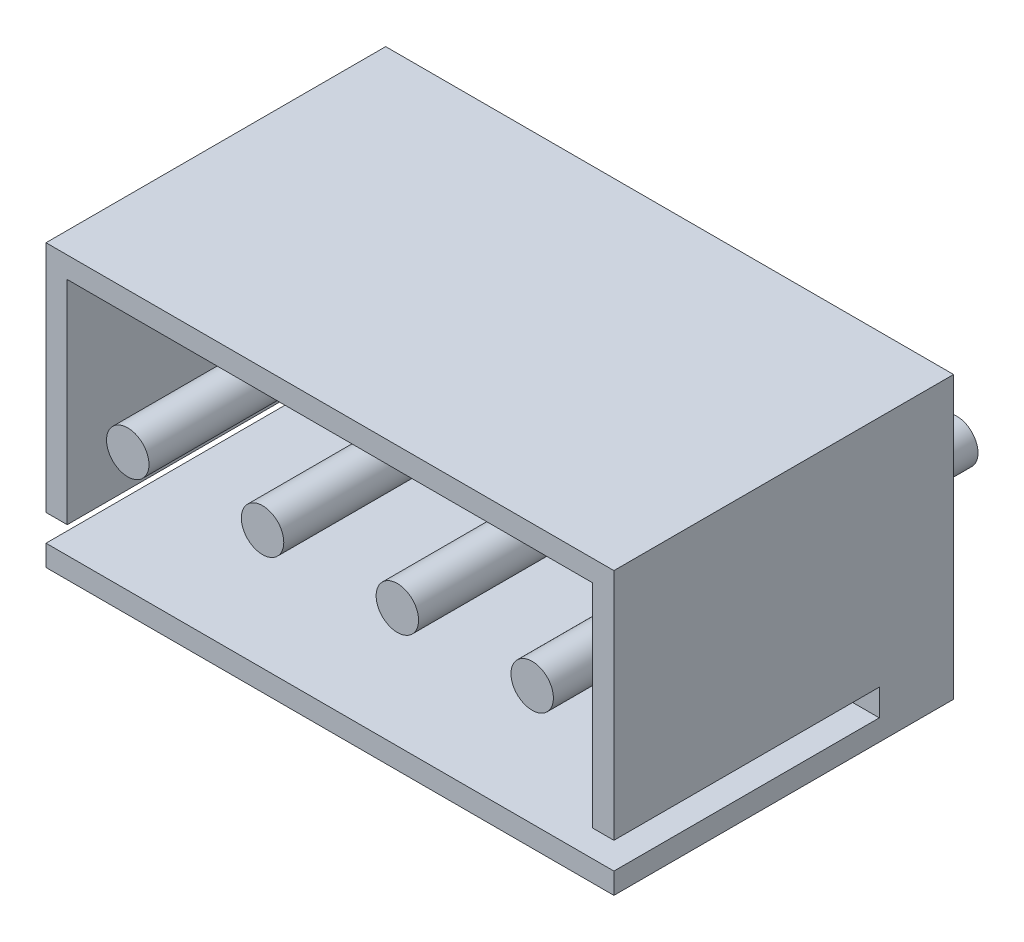
ISO-10303-21;
HEADER;
FILE_DESCRIPTION(('STEP AP214'),'2;1');
FILE_NAME('part.step','',(''),(''),'','','');
FILE_SCHEMA(('AUTOMOTIVE_DESIGN { 1 0 10303 214 1 1 1 1 }'));
ENDSEC;
DATA;
#1=APPLICATION_CONTEXT('core data for automotive mechanical design processes');
#2=APPLICATION_PROTOCOL_DEFINITION('international standard','automotive_design',2000,#1);
#3=PRODUCT_CONTEXT('',#1,'mechanical');
#4=PRODUCT('Part','Part','',(#3));
#5=PRODUCT_RELATED_PRODUCT_CATEGORY('part','',(#4));
#6=PRODUCT_DEFINITION_FORMATION('','',#4);
#7=PRODUCT_DEFINITION_CONTEXT('part definition',#1,'design');
#8=PRODUCT_DEFINITION('design','',#6,#7);
#9=PRODUCT_DEFINITION_SHAPE('','',#8);
#10=(LENGTH_UNIT() NAMED_UNIT(*) SI_UNIT(.MILLI.,.METRE.));
#11=(NAMED_UNIT(*) PLANE_ANGLE_UNIT() SI_UNIT($,.RADIAN.));
#12=(NAMED_UNIT(*) SI_UNIT($,.STERADIAN.) SOLID_ANGLE_UNIT());
#13=UNCERTAINTY_MEASURE_WITH_UNIT(LENGTH_MEASURE(1.E-05),#10,'distance_accuracy_value','');
#14=(GEOMETRIC_REPRESENTATION_CONTEXT(3) GLOBAL_UNCERTAINTY_ASSIGNED_CONTEXT((#13)) GLOBAL_UNIT_ASSIGNED_CONTEXT((#10,
#11,#12)) REPRESENTATION_CONTEXT('',''));
#15=CARTESIAN_POINT('',(0.,0.,0.));
#16=DIRECTION('',(0.,0.,1.));
#17=DIRECTION('',(1.,0.,0.));
#18=AXIS2_PLACEMENT_3D('',#15,#16,#17);
#19=CARTESIAN_POINT('',(-5.35,-2.65,6.4));
#20=DIRECTION('',(0.,0.,1.));
#21=DIRECTION('',(1.,0.,0.));
#22=AXIS2_PLACEMENT_3D('',#19,#20,#21);
#23=PLANE('',#22);
#24=DIRECTION('',(-1.,0.,0.));
#25=VECTOR('',#24,1.);
#26=CARTESIAN_POINT('',(-6.51663395587931,-1.75136681458889,6.4));
#27=LINE('',#26,#25);
#28=CARTESIAN_POINT('',(5.35000000000001,-1.75136681458889,6.4));
#29=VERTEX_POINT('',#28);
#30=CARTESIAN_POINT('',(4.95,-1.75136681458889,6.4));
#31=VERTEX_POINT('',#30);
#32=EDGE_CURVE('E242',#29,#31,#27,.T.);
#33=ORIENTED_EDGE('',*,*,#32,.F.);
#34=DIRECTION('',(0.,1.,0.));
#35=VECTOR('',#34,1.);
#36=CARTESIAN_POINT('',(5.35000000000001,2.65,6.4));
#37=LINE('',#36,#35);
#38=CARTESIAN_POINT('',(5.35000000000001,2.65,6.4));
#39=VERTEX_POINT('',#38);
#40=EDGE_CURVE('E214',#29,#39,#37,.T.);
#41=ORIENTED_EDGE('',*,*,#40,.T.);
#42=DIRECTION('',(-1.,0.,0.));
#43=VECTOR('',#42,1.);
#44=CARTESIAN_POINT('',(-5.35,2.65,6.4));
#45=LINE('',#44,#43);
#46=CARTESIAN_POINT('',(-5.35,2.65,6.4));
#47=VERTEX_POINT('',#46);
#48=EDGE_CURVE('E48',#39,#47,#45,.T.);
#49=ORIENTED_EDGE('',*,*,#48,.T.);
#50=DIRECTION('',(0.,-1.,0.));
#51=VECTOR('',#50,1.);
#52=CARTESIAN_POINT('',(-5.35,2.65,6.4));
#53=LINE('',#52,#51);
#54=CARTESIAN_POINT('',(-5.35,-1.75136681458889,6.4));
#55=VERTEX_POINT('',#54);
#56=EDGE_CURVE('E210',#47,#55,#53,.T.);
#57=ORIENTED_EDGE('',*,*,#56,.T.);
#58=CARTESIAN_POINT('',(-4.95,-1.75136681458889,6.4));
#59=VERTEX_POINT('',#58);
#60=EDGE_CURVE('E137',#59,#55,#27,.T.);
#61=ORIENTED_EDGE('',*,*,#60,.F.);
#62=DIRECTION('',(0.,-1.,0.));
#63=VECTOR('',#62,1.);
#64=CARTESIAN_POINT('',(-4.95,2.25,6.4));
#65=LINE('',#64,#63);
#66=CARTESIAN_POINT('',(-4.95,2.25,6.4));
#67=VERTEX_POINT('',#66);
#68=EDGE_CURVE('E189',#67,#59,#65,.T.);
#69=ORIENTED_EDGE('',*,*,#68,.F.);
#70=DIRECTION('',(-1.,0.,0.));
#71=VECTOR('',#70,1.);
#72=CARTESIAN_POINT('',(4.95000000000001,2.25,6.4));
#73=LINE('',#72,#71);
#74=CARTESIAN_POINT('',(4.95000000000001,2.25,6.4));
#75=VERTEX_POINT('',#74);
#76=EDGE_CURVE('E194',#75,#67,#73,.T.);
#77=ORIENTED_EDGE('',*,*,#76,.F.);
#78=DIRECTION('',(0.,1.,0.));
#79=VECTOR('',#78,1.);
#80=CARTESIAN_POINT('',(4.95,-2.25,6.4));
#81=LINE('',#80,#79);
#82=EDGE_CURVE('E201',#31,#75,#81,.T.);
#83=ORIENTED_EDGE('',*,*,#82,.F.);
#84=EDGE_LOOP('',(#33,#41,#49,#57,#61,#69,#77,#83));
#85=FACE_BOUND('',#84,.T.);
#86=ADVANCED_FACE('F31',(#85),#23,.T.);
#87=CARTESIAN_POINT('',(-5.35,2.65,6.4));
#88=DIRECTION('',(1.,0.,0.));
#89=DIRECTION('',(0.,0.,-1.));
#90=AXIS2_PLACEMENT_3D('',#87,#88,#89);
#91=PLANE('',#90);
#92=DIRECTION('',(0.,-1.,0.));
#93=VECTOR('',#92,1.);
#94=CARTESIAN_POINT('',(-5.35,2.65,1.4));
#95=LINE('',#94,#93);
#96=CARTESIAN_POINT('',(-5.35,-1.75136681458889,1.4));
#97=VERTEX_POINT('',#96);
#98=CARTESIAN_POINT('',(-5.35,-2.25284277885296,1.4));
#99=VERTEX_POINT('',#98);
#100=EDGE_CURVE('E150',#97,#99,#95,.T.);
#101=ORIENTED_EDGE('',*,*,#100,.F.);
#102=DIRECTION('',(0.,0.,1.));
#103=VECTOR('',#102,1.);
#104=CARTESIAN_POINT('',(-5.35,-1.75136681458889,6.4));
#105=LINE('',#104,#103);
#106=EDGE_CURVE('E131',#97,#55,#105,.T.);
#107=ORIENTED_EDGE('',*,*,#106,.T.);
#108=ORIENTED_EDGE('',*,*,#56,.F.);
#109=DIRECTION('',(0.,0.,-1.));
#110=VECTOR('',#109,1.);
#111=CARTESIAN_POINT('',(-5.35,2.65,6.4));
#112=LINE('',#111,#110);
#113=CARTESIAN_POINT('',(-5.35,2.65,0.));
#114=VERTEX_POINT('',#113);
#115=EDGE_CURVE('E219',#47,#114,#112,.T.);
#116=ORIENTED_EDGE('',*,*,#115,.T.);
#117=DIRECTION('',(0.,-1.,0.));
#118=VECTOR('',#117,1.);
#119=CARTESIAN_POINT('',(-5.35,2.65,0.));
#120=LINE('',#119,#118);
#121=CARTESIAN_POINT('',(-5.35,-2.65,0.));
#122=VERTEX_POINT('',#121);
#123=EDGE_CURVE('E207',#114,#122,#120,.T.);
#124=ORIENTED_EDGE('',*,*,#123,.T.);
#125=DIRECTION('',(0.,0.,-1.));
#126=VECTOR('',#125,1.);
#127=CARTESIAN_POINT('',(-5.35,-2.65,6.4));
#128=LINE('',#127,#126);
#129=CARTESIAN_POINT('',(-5.35,-2.65,6.4));
#130=VERTEX_POINT('',#129);
#131=EDGE_CURVE('E11',#130,#122,#128,.T.);
#132=ORIENTED_EDGE('',*,*,#131,.F.);
#133=CARTESIAN_POINT('',(-5.35,-2.25284277885296,6.4));
#134=VERTEX_POINT('',#133);
#135=EDGE_CURVE('E80',#134,#130,#53,.T.);
#136=ORIENTED_EDGE('',*,*,#135,.F.);
#137=DIRECTION('',(0.,0.,-1.));
#138=VECTOR('',#137,1.);
#139=CARTESIAN_POINT('',(-5.35,-2.25284277885296,6.4));
#140=LINE('',#139,#138);
#141=EDGE_CURVE('E159',#134,#99,#140,.T.);
#142=ORIENTED_EDGE('',*,*,#141,.T.);
#143=EDGE_LOOP('',(#101,#107,#108,#116,#124,#132,#136,#142));
#144=FACE_BOUND('',#143,.T.);
#145=ADVANCED_FACE('F33',(#144),#91,.F.);
#146=CARTESIAN_POINT('',(-5.35,-2.65,6.4));
#147=DIRECTION('',(0.,1.,0.));
#148=DIRECTION('',(0.,0.,1.));
#149=AXIS2_PLACEMENT_3D('',#146,#147,#148);
#150=PLANE('',#149);
#151=DIRECTION('',(1.,0.,0.));
#152=VECTOR('',#151,1.);
#153=CARTESIAN_POINT('',(-5.35,-2.65,0.));
#154=LINE('',#153,#152);
#155=CARTESIAN_POINT('',(5.35,-2.65,0.));
#156=VERTEX_POINT('',#155);
#157=EDGE_CURVE('E222',#122,#156,#154,.T.);
#158=ORIENTED_EDGE('',*,*,#157,.T.);
#159=DIRECTION('',(0.,0.,-1.));
#160=VECTOR('',#159,1.);
#161=CARTESIAN_POINT('',(5.35,-2.65,6.4));
#162=LINE('',#161,#160);
#163=CARTESIAN_POINT('',(5.35,-2.65,6.4));
#164=VERTEX_POINT('',#163);
#165=EDGE_CURVE('E40',#164,#156,#162,.T.);
#166=ORIENTED_EDGE('',*,*,#165,.F.);
#167=DIRECTION('',(1.,0.,0.));
#168=VECTOR('',#167,1.);
#169=CARTESIAN_POINT('',(-5.35,-2.65,6.4));
#170=LINE('',#169,#168);
#171=EDGE_CURVE('E212',#130,#164,#170,.T.);
#172=ORIENTED_EDGE('',*,*,#171,.F.);
#173=ORIENTED_EDGE('',*,*,#131,.T.);
#174=EDGE_LOOP('',(#158,#166,#172,#173));
#175=FACE_BOUND('',#174,.T.);
#176=ADVANCED_FACE('F269',(#175),#150,.F.);
#177=CARTESIAN_POINT('',(5.35000000000001,2.65,6.4));
#178=DIRECTION('',(-1.,0.,0.));
#179=DIRECTION('',(0.,-1.,0.));
#180=AXIS2_PLACEMENT_3D('',#177,#178,#179);
#181=PLANE('',#180);
#182=ORIENTED_EDGE('',*,*,#40,.F.);
#183=DIRECTION('',(0.,0.,-1.));
#184=VECTOR('',#183,1.);
#185=CARTESIAN_POINT('',(5.35,-1.75136681458889,6.4));
#186=LINE('',#185,#184);
#187=CARTESIAN_POINT('',(5.35,-1.75136681458889,1.4));
#188=VERTEX_POINT('',#187);
#189=EDGE_CURVE('E142',#29,#188,#186,.T.);
#190=ORIENTED_EDGE('',*,*,#189,.T.);
#191=DIRECTION('',(0.,1.,0.));
#192=VECTOR('',#191,1.);
#193=CARTESIAN_POINT('',(5.35000000000001,2.65,1.4));
#194=LINE('',#193,#192);
#195=CARTESIAN_POINT('',(5.35,-2.25284277885296,1.4));
#196=VERTEX_POINT('',#195);
#197=EDGE_CURVE('E141',#196,#188,#194,.T.);
#198=ORIENTED_EDGE('',*,*,#197,.F.);
#199=DIRECTION('',(0.,0.,1.));
#200=VECTOR('',#199,1.);
#201=CARTESIAN_POINT('',(5.35,-2.25284277885296,6.4));
#202=LINE('',#201,#200);
#203=CARTESIAN_POINT('',(5.35000000000001,-2.25284277885296,6.4));
#204=VERTEX_POINT('',#203);
#205=EDGE_CURVE('E160',#196,#204,#202,.T.);
#206=ORIENTED_EDGE('',*,*,#205,.T.);
#207=EDGE_CURVE('E215',#164,#204,#37,.T.);
#208=ORIENTED_EDGE('',*,*,#207,.F.);
#209=ORIENTED_EDGE('',*,*,#165,.T.);
#210=DIRECTION('',(0.,1.,0.));
#211=VECTOR('',#210,1.);
#212=CARTESIAN_POINT('',(5.35000000000001,2.65,0.));
#213=LINE('',#212,#211);
#214=CARTESIAN_POINT('',(5.35000000000001,2.65,0.));
#215=VERTEX_POINT('',#214);
#216=EDGE_CURVE('E66',#156,#215,#213,.T.);
#217=ORIENTED_EDGE('',*,*,#216,.T.);
#218=DIRECTION('',(0.,0.,-1.));
#219=VECTOR('',#218,1.);
#220=CARTESIAN_POINT('',(5.35000000000001,2.65,6.4));
#221=LINE('',#220,#219);
#222=EDGE_CURVE('E227',#39,#215,#221,.T.);
#223=ORIENTED_EDGE('',*,*,#222,.F.);
#224=EDGE_LOOP('',(#182,#190,#198,#206,#208,#209,#217,#223));
#225=FACE_BOUND('',#224,.T.);
#226=ADVANCED_FACE('F231',(#225),#181,.F.);
#227=CARTESIAN_POINT('',(-5.35,2.65,6.4));
#228=DIRECTION('',(0.,-1.,0.));
#229=DIRECTION('',(1.,0.,0.));
#230=AXIS2_PLACEMENT_3D('',#227,#228,#229);
#231=PLANE('',#230);
#232=DIRECTION('',(-1.,0.,0.));
#233=VECTOR('',#232,1.);
#234=CARTESIAN_POINT('',(-5.35,2.65,0.));
#235=LINE('',#234,#233);
#236=EDGE_CURVE('E72',#215,#114,#235,.T.);
#237=ORIENTED_EDGE('',*,*,#236,.T.);
#238=ORIENTED_EDGE('',*,*,#115,.F.);
#239=ORIENTED_EDGE('',*,*,#48,.F.);
#240=ORIENTED_EDGE('',*,*,#222,.T.);
#241=EDGE_LOOP('',(#237,#238,#239,#240));
#242=FACE_BOUND('',#241,.T.);
#243=ADVANCED_FACE('F237',(#242),#231,.F.);
#244=DIRECTION('',(1.,0.,0.));
#245=VECTOR('',#244,1.);
#246=CARTESIAN_POINT('',(-6.51663395587931,-2.25284277885296,6.4));
#247=LINE('',#246,#245);
#248=EDGE_CURVE('E248',#134,#204,#247,.T.);
#249=ORIENTED_EDGE('',*,*,#248,.F.);
#250=ORIENTED_EDGE('',*,*,#135,.T.);
#251=ORIENTED_EDGE('',*,*,#171,.T.);
#252=ORIENTED_EDGE('',*,*,#207,.T.);
#253=EDGE_LOOP('',(#249,#250,#251,#252));
#254=FACE_BOUND('',#253,.T.);
#255=ADVANCED_FACE('F268',(#254),#23,.T.);
#256=CARTESIAN_POINT('',(-5.35,-2.65,0.));
#257=DIRECTION('',(0.,0.,1.));
#258=DIRECTION('',(1.,0.,0.));
#259=AXIS2_PLACEMENT_3D('',#256,#257,#258);
#260=PLANE('',#259);
#261=CARTESIAN_POINT('',(3.81,0.,0.));
#262=DIRECTION('',(0.,0.,1.));
#263=DIRECTION('',(1.,0.,0.));
#264=AXIS2_PLACEMENT_3D('',#261,#262,#263);
#265=CIRCLE('',#264,0.4);
#266=CARTESIAN_POINT('',(4.21,0.,0.));
#267=VERTEX_POINT('',#266);
#268=EDGE_CURVE('E551',#267,#267,#265,.T.);
#269=ORIENTED_EDGE('',*,*,#268,.T.);
#270=EDGE_LOOP('',(#269));
#271=FACE_BOUND('',#270,.T.);
#272=CARTESIAN_POINT('',(-3.81,0.,0.));
#273=DIRECTION('',(0.,0.,1.));
#274=DIRECTION('',(1.,0.,0.));
#275=AXIS2_PLACEMENT_3D('',#272,#273,#274);
#276=CIRCLE('',#275,0.4);
#277=CARTESIAN_POINT('',(-3.41,0.,0.));
#278=VERTEX_POINT('',#277);
#279=EDGE_CURVE('E559',#278,#278,#276,.T.);
#280=ORIENTED_EDGE('',*,*,#279,.T.);
#281=EDGE_LOOP('',(#280));
#282=FACE_BOUND('',#281,.T.);
#283=CARTESIAN_POINT('',(1.27,0.,0.));
#284=DIRECTION('',(0.,0.,1.));
#285=DIRECTION('',(1.,0.,0.));
#286=AXIS2_PLACEMENT_3D('',#283,#284,#285);
#287=CIRCLE('',#286,0.4);
#288=CARTESIAN_POINT('',(1.67,0.,0.));
#289=VERTEX_POINT('',#288);
#290=EDGE_CURVE('E565',#289,#289,#287,.T.);
#291=ORIENTED_EDGE('',*,*,#290,.T.);
#292=EDGE_LOOP('',(#291));
#293=FACE_BOUND('',#292,.T.);
#294=CARTESIAN_POINT('',(-1.27,0.,0.));
#295=DIRECTION('',(0.,0.,1.));
#296=DIRECTION('',(1.,0.,0.));
#297=AXIS2_PLACEMENT_3D('',#294,#295,#296);
#298=CIRCLE('',#297,0.4);
#299=CARTESIAN_POINT('',(-0.87,0.,0.));
#300=VERTEX_POINT('',#299);
#301=EDGE_CURVE('E571',#300,#300,#298,.T.);
#302=ORIENTED_EDGE('',*,*,#301,.T.);
#303=EDGE_LOOP('',(#302));
#304=FACE_BOUND('',#303,.T.);
#305=ORIENTED_EDGE('',*,*,#123,.F.);
#306=ORIENTED_EDGE('',*,*,#236,.F.);
#307=ORIENTED_EDGE('',*,*,#216,.F.);
#308=ORIENTED_EDGE('',*,*,#157,.F.);
#309=EDGE_LOOP('',(#305,#306,#307,#308));
#310=FACE_BOUND('',#309,.T.);
#311=ADVANCED_FACE('F235',(#271,#282,#293,#304,#310),#260,.F.);
#312=CARTESIAN_POINT('',(-4.95,2.25,1.4));
#313=DIRECTION('',(-1.,0.,0.));
#314=DIRECTION('',(0.,0.,1.));
#315=AXIS2_PLACEMENT_3D('',#312,#313,#314);
#316=PLANE('',#315);
#317=ORIENTED_EDGE('',*,*,#68,.T.);
#318=DIRECTION('',(0.,0.,-1.));
#319=VECTOR('',#318,1.);
#320=CARTESIAN_POINT('',(-4.95,-1.75136681458889,1.4));
#321=LINE('',#320,#319);
#322=CARTESIAN_POINT('',(-4.95,-1.75136681458889,1.4));
#323=VERTEX_POINT('',#322);
#324=EDGE_CURVE('E254',#59,#323,#321,.T.);
#325=ORIENTED_EDGE('',*,*,#324,.T.);
#326=DIRECTION('',(0.,-1.,0.));
#327=VECTOR('',#326,1.);
#328=CARTESIAN_POINT('',(-4.95,2.25,1.4));
#329=LINE('',#328,#327);
#330=CARTESIAN_POINT('',(-4.95,2.25,1.4));
#331=VERTEX_POINT('',#330);
#332=EDGE_CURVE('E154',#331,#323,#329,.T.);
#333=ORIENTED_EDGE('',*,*,#332,.F.);
#334=DIRECTION('',(0.,0.,1.));
#335=VECTOR('',#334,1.);
#336=CARTESIAN_POINT('',(-4.95,2.25,1.4));
#337=LINE('',#336,#335);
#338=EDGE_CURVE('E205',#331,#67,#337,.T.);
#339=ORIENTED_EDGE('',*,*,#338,.T.);
#340=EDGE_LOOP('',(#317,#325,#333,#339));
#341=FACE_BOUND('',#340,.T.);
#342=ADVANCED_FACE('F257',(#341),#316,.F.);
#343=CARTESIAN_POINT('',(4.95000000000001,2.25,1.4));
#344=DIRECTION('',(0.,1.,0.));
#345=DIRECTION('',(-1.,0.,0.));
#346=AXIS2_PLACEMENT_3D('',#343,#344,#345);
#347=PLANE('',#346);
#348=ORIENTED_EDGE('',*,*,#76,.T.);
#349=ORIENTED_EDGE('',*,*,#338,.F.);
#350=DIRECTION('',(-1.,0.,0.));
#351=VECTOR('',#350,1.);
#352=CARTESIAN_POINT('',(4.95000000000001,2.25,1.4));
#353=LINE('',#352,#351);
#354=CARTESIAN_POINT('',(4.95000000000001,2.25,1.4));
#355=VERTEX_POINT('',#354);
#356=EDGE_CURVE('E196',#355,#331,#353,.T.);
#357=ORIENTED_EDGE('',*,*,#356,.F.);
#358=DIRECTION('',(0.,0.,1.));
#359=VECTOR('',#358,1.);
#360=CARTESIAN_POINT('',(4.95000000000001,2.25,1.4));
#361=LINE('',#360,#359);
#362=EDGE_CURVE('E198',#355,#75,#361,.T.);
#363=ORIENTED_EDGE('',*,*,#362,.T.);
#364=EDGE_LOOP('',(#348,#349,#357,#363));
#365=FACE_BOUND('',#364,.T.);
#366=ADVANCED_FACE('F260',(#365),#347,.F.);
#367=CARTESIAN_POINT('',(4.95,-2.25,1.4));
#368=DIRECTION('',(1.,0.,0.));
#369=DIRECTION('',(0.,1.,0.));
#370=AXIS2_PLACEMENT_3D('',#367,#368,#369);
#371=PLANE('',#370);
#372=DIRECTION('',(0.,1.,0.));
#373=VECTOR('',#372,1.);
#374=CARTESIAN_POINT('',(4.95,-2.25,1.4));
#375=LINE('',#374,#373);
#376=CARTESIAN_POINT('',(4.95000000000001,-1.75136681458889,1.4));
#377=VERTEX_POINT('',#376);
#378=EDGE_CURVE('E193',#377,#355,#375,.T.);
#379=ORIENTED_EDGE('',*,*,#378,.F.);
#380=DIRECTION('',(0.,0.,1.));
#381=VECTOR('',#380,1.);
#382=CARTESIAN_POINT('',(4.95,-1.75136681458889,1.4));
#383=LINE('',#382,#381);
#384=EDGE_CURVE('E252',#377,#31,#383,.T.);
#385=ORIENTED_EDGE('',*,*,#384,.T.);
#386=ORIENTED_EDGE('',*,*,#82,.T.);
#387=ORIENTED_EDGE('',*,*,#362,.F.);
#388=EDGE_LOOP('',(#379,#385,#386,#387));
#389=FACE_BOUND('',#388,.T.);
#390=ADVANCED_FACE('F265',(#389),#371,.F.);
#391=CARTESIAN_POINT('',(-4.95,-2.25,1.4));
#392=DIRECTION('',(0.,0.,1.));
#393=DIRECTION('',(1.,0.,0.));
#394=AXIS2_PLACEMENT_3D('',#391,#392,#393);
#395=PLANE('',#394);
#396=DIRECTION('',(1.,0.,0.));
#397=VECTOR('',#396,1.);
#398=CARTESIAN_POINT('',(-6.51663395587931,-1.75136681458889,1.4));
#399=LINE('',#398,#397);
#400=EDGE_CURVE('E156',#377,#188,#399,.T.);
#401=ORIENTED_EDGE('',*,*,#400,.F.);
#402=ORIENTED_EDGE('',*,*,#378,.T.);
#403=ORIENTED_EDGE('',*,*,#356,.T.);
#404=ORIENTED_EDGE('',*,*,#332,.T.);
#405=EDGE_CURVE('E134',#97,#323,#399,.T.);
#406=ORIENTED_EDGE('',*,*,#405,.F.);
#407=ORIENTED_EDGE('',*,*,#100,.T.);
#408=DIRECTION('',(-1.,0.,0.));
#409=VECTOR('',#408,1.);
#410=CARTESIAN_POINT('',(-6.51663395587931,-2.25284277885296,1.4));
#411=LINE('',#410,#409);
#412=EDGE_CURVE('E155',#196,#99,#411,.T.);
#413=ORIENTED_EDGE('',*,*,#412,.F.);
#414=ORIENTED_EDGE('',*,*,#197,.T.);
#415=EDGE_LOOP('',(#401,#402,#403,#404,#406,#407,#413,#414));
#416=FACE_BOUND('',#415,.T.);
#417=CARTESIAN_POINT('',(3.81,0.,1.4));
#418=DIRECTION('',(0.,0.,1.));
#419=DIRECTION('',(-1.,0.,0.));
#420=AXIS2_PLACEMENT_3D('',#417,#418,#419);
#421=CIRCLE('',#420,0.4);
#422=CARTESIAN_POINT('',(3.41,0.,1.4));
#423=VERTEX_POINT('',#422);
#424=EDGE_CURVE('E168',#423,#423,#421,.T.);
#425=ORIENTED_EDGE('',*,*,#424,.F.);
#426=EDGE_LOOP('',(#425));
#427=FACE_BOUND('',#426,.T.);
#428=CARTESIAN_POINT('',(-3.81,0.,1.4));
#429=DIRECTION('',(0.,0.,1.));
#430=DIRECTION('',(1.,0.,0.));
#431=AXIS2_PLACEMENT_3D('',#428,#429,#430);
#432=CIRCLE('',#431,0.4);
#433=CARTESIAN_POINT('',(-3.41,0.,1.4));
#434=VERTEX_POINT('',#433);
#435=EDGE_CURVE('E174',#434,#434,#432,.T.);
#436=ORIENTED_EDGE('',*,*,#435,.F.);
#437=EDGE_LOOP('',(#436));
#438=FACE_BOUND('',#437,.T.);
#439=CARTESIAN_POINT('',(1.27,0.,1.4));
#440=DIRECTION('',(0.,0.,1.));
#441=DIRECTION('',(1.,0.,0.));
#442=AXIS2_PLACEMENT_3D('',#439,#440,#441);
#443=CIRCLE('',#442,0.4);
#444=CARTESIAN_POINT('',(1.67,0.,1.4));
#445=VERTEX_POINT('',#444);
#446=EDGE_CURVE('E180',#445,#445,#443,.T.);
#447=ORIENTED_EDGE('',*,*,#446,.F.);
#448=EDGE_LOOP('',(#447));
#449=FACE_BOUND('',#448,.T.);
#450=CARTESIAN_POINT('',(-1.27,0.,1.4));
#451=DIRECTION('',(0.,0.,1.));
#452=DIRECTION('',(1.,0.,0.));
#453=AXIS2_PLACEMENT_3D('',#450,#451,#452);
#454=CIRCLE('',#453,0.4);
#455=CARTESIAN_POINT('',(-0.87,0.,1.4));
#456=VERTEX_POINT('',#455);
#457=EDGE_CURVE('E186',#456,#456,#454,.T.);
#458=ORIENTED_EDGE('',*,*,#457,.F.);
#459=EDGE_LOOP('',(#458));
#460=FACE_BOUND('',#459,.T.);
#461=ADVANCED_FACE('F147',(#416,#427,#438,#449,#460),#395,.T.);
#462=CARTESIAN_POINT('',(-1.27,0.,1.4));
#463=DIRECTION('',(0.,0.,1.));
#464=DIRECTION('',(1.,0.,0.));
#465=AXIS2_PLACEMENT_3D('',#462,#463,#464);
#466=CYLINDRICAL_SURFACE('',#465,0.4);
#467=ORIENTED_EDGE('',*,*,#457,.T.);
#468=EDGE_LOOP('',(#467));
#469=FACE_BOUND('',#468,.T.);
#470=CARTESIAN_POINT('',(-1.27,0.,6.4));
#471=DIRECTION('',(0.,0.,1.));
#472=DIRECTION('',(1.,0.,0.));
#473=AXIS2_PLACEMENT_3D('',#470,#471,#472);
#474=CIRCLE('',#473,0.4);
#475=CARTESIAN_POINT('',(-0.87,0.,6.4));
#476=VERTEX_POINT('',#475);
#477=EDGE_CURVE('E183',#476,#476,#474,.T.);
#478=ORIENTED_EDGE('',*,*,#477,.F.);
#479=EDGE_LOOP('',(#478));
#480=FACE_BOUND('',#479,.T.);
#481=ADVANCED_FACE('F322',(#469,#480),#466,.T.);
#482=CARTESIAN_POINT('',(1.27,0.,1.4));
#483=DIRECTION('',(0.,0.,1.));
#484=DIRECTION('',(1.,0.,0.));
#485=AXIS2_PLACEMENT_3D('',#482,#483,#484);
#486=CYLINDRICAL_SURFACE('',#485,0.4);
#487=ORIENTED_EDGE('',*,*,#446,.T.);
#488=EDGE_LOOP('',(#487));
#489=FACE_BOUND('',#488,.T.);
#490=CARTESIAN_POINT('',(1.27,0.,6.4));
#491=DIRECTION('',(0.,0.,1.));
#492=DIRECTION('',(1.,0.,0.));
#493=AXIS2_PLACEMENT_3D('',#490,#491,#492);
#494=CIRCLE('',#493,0.4);
#495=CARTESIAN_POINT('',(1.67,0.,6.4));
#496=VERTEX_POINT('',#495);
#497=EDGE_CURVE('E177',#496,#496,#494,.T.);
#498=ORIENTED_EDGE('',*,*,#497,.F.);
#499=EDGE_LOOP('',(#498));
#500=FACE_BOUND('',#499,.T.);
#501=ADVANCED_FACE('F316',(#489,#500),#486,.T.);
#502=CARTESIAN_POINT('',(-3.81,0.,1.4));
#503=DIRECTION('',(0.,0.,1.));
#504=DIRECTION('',(1.,0.,0.));
#505=AXIS2_PLACEMENT_3D('',#502,#503,#504);
#506=CYLINDRICAL_SURFACE('',#505,0.4);
#507=ORIENTED_EDGE('',*,*,#435,.T.);
#508=EDGE_LOOP('',(#507));
#509=FACE_BOUND('',#508,.T.);
#510=CARTESIAN_POINT('',(-3.81,0.,6.4));
#511=DIRECTION('',(0.,0.,1.));
#512=DIRECTION('',(1.,0.,0.));
#513=AXIS2_PLACEMENT_3D('',#510,#511,#512);
#514=CIRCLE('',#513,0.4);
#515=CARTESIAN_POINT('',(-3.41,0.,6.4));
#516=VERTEX_POINT('',#515);
#517=EDGE_CURVE('E171',#516,#516,#514,.T.);
#518=ORIENTED_EDGE('',*,*,#517,.F.);
#519=EDGE_LOOP('',(#518));
#520=FACE_BOUND('',#519,.T.);
#521=ADVANCED_FACE('F310',(#509,#520),#506,.T.);
#522=CARTESIAN_POINT('',(3.81,0.,1.4));
#523=DIRECTION('',(0.,0.,1.));
#524=DIRECTION('',(1.,0.,0.));
#525=AXIS2_PLACEMENT_3D('',#522,#523,#524);
#526=CYLINDRICAL_SURFACE('',#525,0.4);
#527=ORIENTED_EDGE('',*,*,#424,.T.);
#528=EDGE_LOOP('',(#527));
#529=FACE_BOUND('',#528,.T.);
#530=CARTESIAN_POINT('',(3.81,0.,6.4));
#531=DIRECTION('',(0.,0.,1.));
#532=DIRECTION('',(-1.,0.,0.));
#533=AXIS2_PLACEMENT_3D('',#530,#531,#532);
#534=CIRCLE('',#533,0.4);
#535=CARTESIAN_POINT('',(3.41,0.,6.4));
#536=VERTEX_POINT('',#535);
#537=EDGE_CURVE('E167',#536,#536,#534,.T.);
#538=ORIENTED_EDGE('',*,*,#537,.F.);
#539=EDGE_LOOP('',(#538));
#540=FACE_BOUND('',#539,.T.);
#541=ADVANCED_FACE('F303',(#529,#540),#526,.T.);
#542=ORIENTED_EDGE('',*,*,#517,.T.);
#543=EDGE_LOOP('',(#542));
#544=FACE_BOUND('',#543,.T.);
#545=ADVANCED_FACE('F297',(#544),#23,.T.);
#546=ORIENTED_EDGE('',*,*,#497,.T.);
#547=EDGE_LOOP('',(#546));
#548=FACE_BOUND('',#547,.T.);
#549=ADVANCED_FACE('F285',(#548),#23,.T.);
#550=ORIENTED_EDGE('',*,*,#477,.T.);
#551=EDGE_LOOP('',(#550));
#552=FACE_BOUND('',#551,.T.);
#553=ADVANCED_FACE('F278',(#552),#23,.T.);
#554=ORIENTED_EDGE('',*,*,#537,.T.);
#555=EDGE_LOOP('',(#554));
#556=FACE_BOUND('',#555,.T.);
#557=ADVANCED_FACE('F284',(#556),#23,.T.);
#558=CARTESIAN_POINT('',(-6.51663395587931,-2.25284277885296,-11.5091604774039));
#559=DIRECTION('',(0.,-1.,0.));
#560=DIRECTION('',(0.,0.,-1.));
#561=AXIS2_PLACEMENT_3D('',#558,#559,#560);
#562=PLANE('',#561);
#563=ORIENTED_EDGE('',*,*,#248,.T.);
#564=ORIENTED_EDGE('',*,*,#205,.F.);
#565=ORIENTED_EDGE('',*,*,#412,.T.);
#566=ORIENTED_EDGE('',*,*,#141,.F.);
#567=EDGE_LOOP('',(#563,#564,#565,#566));
#568=FACE_BOUND('',#567,.T.);
#569=ADVANCED_FACE('F295',(#568),#562,.F.);
#570=CARTESIAN_POINT('',(-6.51663395587931,-1.75136681458889,-11.5091604774039));
#571=DIRECTION('',(0.,1.,0.));
#572=DIRECTION('',(0.,0.,1.));
#573=AXIS2_PLACEMENT_3D('',#570,#571,#572);
#574=PLANE('',#573);
#575=ORIENTED_EDGE('',*,*,#405,.T.);
#576=ORIENTED_EDGE('',*,*,#324,.F.);
#577=ORIENTED_EDGE('',*,*,#60,.T.);
#578=ORIENTED_EDGE('',*,*,#106,.F.);
#579=EDGE_LOOP('',(#575,#576,#577,#578));
#580=FACE_BOUND('',#579,.T.);
#581=ADVANCED_FACE('F133',(#580),#574,.F.);
#582=ORIENTED_EDGE('',*,*,#32,.T.);
#583=ORIENTED_EDGE('',*,*,#384,.F.);
#584=ORIENTED_EDGE('',*,*,#400,.T.);
#585=ORIENTED_EDGE('',*,*,#189,.F.);
#586=EDGE_LOOP('',(#582,#583,#584,#585));
#587=FACE_BOUND('',#586,.T.);
#588=ADVANCED_FACE('F266',(#587),#574,.F.);
#589=CARTESIAN_POINT('',(-1.27,0.,-1.6));
#590=DIRECTION('',(0.,0.,1.));
#591=DIRECTION('',(1.,0.,0.));
#592=AXIS2_PLACEMENT_3D('',#589,#590,#591);
#593=CYLINDRICAL_SURFACE('',#592,0.4);
#594=CARTESIAN_POINT('',(-1.27,0.,-1.6));
#595=DIRECTION('',(0.,0.,1.));
#596=DIRECTION('',(1.,0.,0.));
#597=AXIS2_PLACEMENT_3D('',#594,#595,#596);
#598=CIRCLE('',#597,0.4);
#599=CARTESIAN_POINT('',(-0.87,0.,-1.6));
#600=VERTEX_POINT('',#599);
#601=EDGE_CURVE('E568',#600,#600,#598,.T.);
#602=ORIENTED_EDGE('',*,*,#601,.T.);
#603=EDGE_LOOP('',(#602));
#604=FACE_BOUND('',#603,.T.);
#605=ORIENTED_EDGE('',*,*,#301,.F.);
#606=EDGE_LOOP('',(#605));
#607=FACE_BOUND('',#606,.T.);
#608=ADVANCED_FACE('F429',(#604,#607),#593,.T.);
#609=CARTESIAN_POINT('',(-1.27,0.,-1.6));
#610=DIRECTION('',(0.,0.,1.));
#611=DIRECTION('',(1.,0.,0.));
#612=AXIS2_PLACEMENT_3D('',#609,#610,#611);
#613=PLANE('',#612);
#614=ORIENTED_EDGE('',*,*,#601,.F.);
#615=EDGE_LOOP('',(#614));
#616=FACE_BOUND('',#615,.T.);
#617=ADVANCED_FACE('F434',(#616),#613,.F.);
#618=CARTESIAN_POINT('',(1.27,0.,-1.6));
#619=DIRECTION('',(0.,0.,1.));
#620=DIRECTION('',(1.,0.,0.));
#621=AXIS2_PLACEMENT_3D('',#618,#619,#620);
#622=CYLINDRICAL_SURFACE('',#621,0.4);
#623=CARTESIAN_POINT('',(1.27,0.,-1.6));
#624=DIRECTION('',(0.,0.,1.));
#625=DIRECTION('',(1.,0.,0.));
#626=AXIS2_PLACEMENT_3D('',#623,#624,#625);
#627=CIRCLE('',#626,0.4);
#628=CARTESIAN_POINT('',(1.67,0.,-1.6));
#629=VERTEX_POINT('',#628);
#630=EDGE_CURVE('E562',#629,#629,#627,.T.);
#631=ORIENTED_EDGE('',*,*,#630,.T.);
#632=EDGE_LOOP('',(#631));
#633=FACE_BOUND('',#632,.T.);
#634=ORIENTED_EDGE('',*,*,#290,.F.);
#635=EDGE_LOOP('',(#634));
#636=FACE_BOUND('',#635,.T.);
#637=ADVANCED_FACE('F444',(#633,#636),#622,.T.);
#638=CARTESIAN_POINT('',(1.27,0.,-1.6));
#639=DIRECTION('',(0.,0.,1.));
#640=DIRECTION('',(1.,0.,0.));
#641=AXIS2_PLACEMENT_3D('',#638,#639,#640);
#642=PLANE('',#641);
#643=ORIENTED_EDGE('',*,*,#630,.F.);
#644=EDGE_LOOP('',(#643));
#645=FACE_BOUND('',#644,.T.);
#646=ADVANCED_FACE('F454',(#645),#642,.F.);
#647=CARTESIAN_POINT('',(-3.81,0.,-1.6));
#648=DIRECTION('',(0.,0.,1.));
#649=DIRECTION('',(1.,0.,0.));
#650=AXIS2_PLACEMENT_3D('',#647,#648,#649);
#651=CYLINDRICAL_SURFACE('',#650,0.4);
#652=CARTESIAN_POINT('',(-3.81,0.,-1.6));
#653=DIRECTION('',(0.,0.,1.));
#654=DIRECTION('',(1.,0.,0.));
#655=AXIS2_PLACEMENT_3D('',#652,#653,#654);
#656=CIRCLE('',#655,0.4);
#657=CARTESIAN_POINT('',(-3.41,0.,-1.6));
#658=VERTEX_POINT('',#657);
#659=EDGE_CURVE('E554',#658,#658,#656,.T.);
#660=ORIENTED_EDGE('',*,*,#659,.T.);
#661=EDGE_LOOP('',(#660));
#662=FACE_BOUND('',#661,.T.);
#663=ORIENTED_EDGE('',*,*,#279,.F.);
#664=EDGE_LOOP('',(#663));
#665=FACE_BOUND('',#664,.T.);
#666=ADVANCED_FACE('F464',(#662,#665),#651,.T.);
#667=CARTESIAN_POINT('',(-3.81,0.,-1.6));
#668=DIRECTION('',(0.,0.,1.));
#669=DIRECTION('',(1.,0.,0.));
#670=AXIS2_PLACEMENT_3D('',#667,#668,#669);
#671=PLANE('',#670);
#672=ORIENTED_EDGE('',*,*,#659,.F.);
#673=EDGE_LOOP('',(#672));
#674=FACE_BOUND('',#673,.T.);
#675=ADVANCED_FACE('F474',(#674),#671,.F.);
#676=CARTESIAN_POINT('',(3.81,0.,-1.6));
#677=DIRECTION('',(0.,0.,1.));
#678=DIRECTION('',(1.,0.,0.));
#679=AXIS2_PLACEMENT_3D('',#676,#677,#678);
#680=CYLINDRICAL_SURFACE('',#679,0.4);
#681=CARTESIAN_POINT('',(3.81,0.,-1.6));
#682=DIRECTION('',(0.,0.,1.));
#683=DIRECTION('',(1.,0.,0.));
#684=AXIS2_PLACEMENT_3D('',#681,#682,#683);
#685=CIRCLE('',#684,0.4);
#686=CARTESIAN_POINT('',(4.21,0.,-1.6));
#687=VERTEX_POINT('',#686);
#688=EDGE_CURVE('E550',#687,#687,#685,.T.);
#689=ORIENTED_EDGE('',*,*,#688,.T.);
#690=EDGE_LOOP('',(#689));
#691=FACE_BOUND('',#690,.T.);
#692=ORIENTED_EDGE('',*,*,#268,.F.);
#693=EDGE_LOOP('',(#692));
#694=FACE_BOUND('',#693,.T.);
#695=ADVANCED_FACE('F484',(#691,#694),#680,.T.);
#696=CARTESIAN_POINT('',(3.81,0.,-1.6));
#697=DIRECTION('',(0.,0.,1.));
#698=DIRECTION('',(1.,0.,0.));
#699=AXIS2_PLACEMENT_3D('',#696,#697,#698);
#700=PLANE('',#699);
#701=ORIENTED_EDGE('',*,*,#688,.F.);
#702=EDGE_LOOP('',(#701));
#703=FACE_BOUND('',#702,.T.);
#704=ADVANCED_FACE('F494',(#703),#700,.F.);
#705=CLOSED_SHELL('',(#86,#145,#176,#226,#243,#255,#311,#342,#366,#390,#461,#481,#501,#521,#541,
#545,#549,#553,#557,#569,#581,#588,#608,#617,#637,#646,#666,#675,#695,#704));
#706=MANIFOLD_SOLID_BREP('B2',#705);
#707=ADVANCED_BREP_SHAPE_REPRESENTATION('',(#18,#706),#14);
#708=SHAPE_DEFINITION_REPRESENTATION(#9,#707);
ENDSEC;
END-ISO-10303-21;
